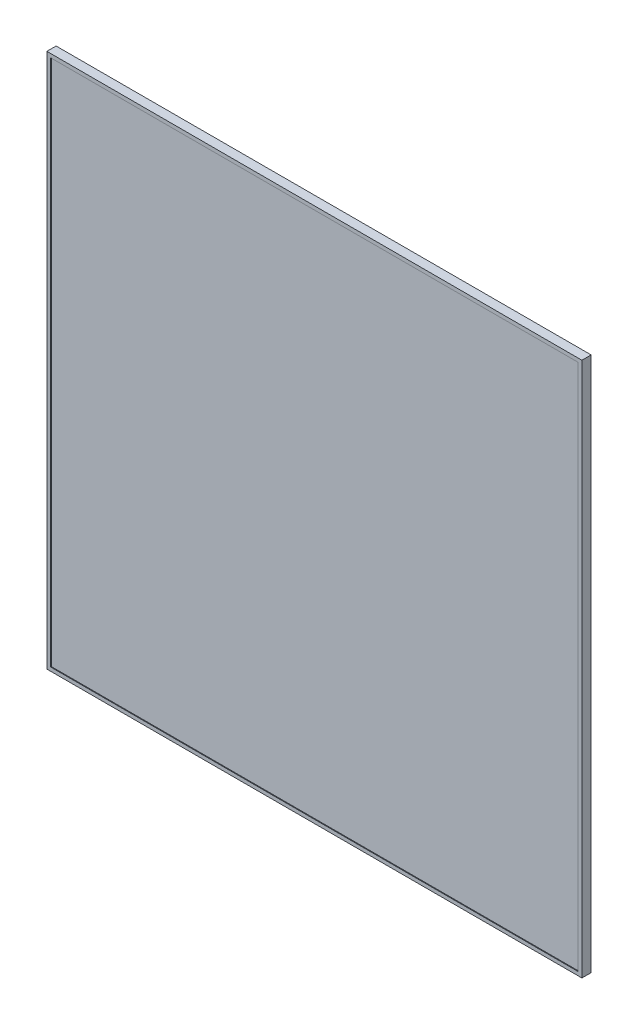
ISO-10303-21;
HEADER;
FILE_DESCRIPTION(('STEP AP214'),'2;1');
FILE_NAME('part.step','',(''),(''),'','','');
FILE_SCHEMA(('AUTOMOTIVE_DESIGN { 1 0 10303 214 1 1 1 1 }'));
ENDSEC;
DATA;
#1=APPLICATION_CONTEXT('core data for automotive mechanical design processes');
#2=APPLICATION_PROTOCOL_DEFINITION('international standard','automotive_design',2000,#1);
#3=PRODUCT_CONTEXT('',#1,'mechanical');
#4=PRODUCT('Part','Part','',(#3));
#5=PRODUCT_RELATED_PRODUCT_CATEGORY('part','',(#4));
#6=PRODUCT_DEFINITION_FORMATION('','',#4);
#7=PRODUCT_DEFINITION_CONTEXT('part definition',#1,'design');
#8=PRODUCT_DEFINITION('design','',#6,#7);
#9=PRODUCT_DEFINITION_SHAPE('','',#8);
#10=(LENGTH_UNIT() NAMED_UNIT(*) SI_UNIT(.MILLI.,.METRE.));
#11=(NAMED_UNIT(*) PLANE_ANGLE_UNIT() SI_UNIT($,.RADIAN.));
#12=(NAMED_UNIT(*) SI_UNIT($,.STERADIAN.) SOLID_ANGLE_UNIT());
#13=UNCERTAINTY_MEASURE_WITH_UNIT(LENGTH_MEASURE(1.E-05),#10,'distance_accuracy_value','');
#14=(GEOMETRIC_REPRESENTATION_CONTEXT(3) GLOBAL_UNCERTAINTY_ASSIGNED_CONTEXT((#13)) GLOBAL_UNIT_ASSIGNED_CONTEXT((#10,
#11,#12)) REPRESENTATION_CONTEXT('',''));
#15=CARTESIAN_POINT('',(0.,0.,0.));
#16=DIRECTION('',(0.,0.,1.));
#17=DIRECTION('',(1.,0.,0.));
#18=AXIS2_PLACEMENT_3D('',#15,#16,#17);
#19=CARTESIAN_POINT('',(72.5,72.5,1.25));
#20=DIRECTION('',(-1.,0.,0.));
#21=DIRECTION('',(0.,0.,1.));
#22=AXIS2_PLACEMENT_3D('',#19,#20,#21);
#23=PLANE('',#22);
#24=DIRECTION('',(0.,1.,0.));
#25=VECTOR('',#24,1.);
#26=CARTESIAN_POINT('',(72.5,72.5,-1.25));
#27=LINE('',#26,#25);
#28=CARTESIAN_POINT('',(72.5,-72.5,-1.25));
#29=VERTEX_POINT('',#28);
#30=CARTESIAN_POINT('',(72.5,72.5,-1.25));
#31=VERTEX_POINT('',#30);
#32=EDGE_CURVE('E158',#29,#31,#27,.T.);
#33=ORIENTED_EDGE('',*,*,#32,.T.);
#34=DIRECTION('',(0.,0.,-1.));
#35=VECTOR('',#34,1.);
#36=CARTESIAN_POINT('',(72.5,72.5,1.25));
#37=LINE('',#36,#35);
#38=CARTESIAN_POINT('',(72.5,72.5,1.25));
#39=VERTEX_POINT('',#38);
#40=EDGE_CURVE('E11',#39,#31,#37,.T.);
#41=ORIENTED_EDGE('',*,*,#40,.F.);
#42=DIRECTION('',(0.,1.,0.));
#43=VECTOR('',#42,1.);
#44=CARTESIAN_POINT('',(72.5,72.5,1.25));
#45=LINE('',#44,#43);
#46=CARTESIAN_POINT('',(72.5,-72.5,1.25));
#47=VERTEX_POINT('',#46);
#48=EDGE_CURVE('E164',#47,#39,#45,.T.);
#49=ORIENTED_EDGE('',*,*,#48,.F.);
#50=DIRECTION('',(0.,0.,-1.));
#51=VECTOR('',#50,1.);
#52=CARTESIAN_POINT('',(72.5,-72.5,1.25));
#53=LINE('',#52,#51);
#54=EDGE_CURVE('E174',#47,#29,#53,.T.);
#55=ORIENTED_EDGE('',*,*,#54,.T.);
#56=EDGE_LOOP('',(#33,#41,#49,#55));
#57=FACE_BOUND('',#56,.T.);
#58=ADVANCED_FACE('F39',(#57),#23,.F.);
#59=CARTESIAN_POINT('',(-72.5,72.5,1.25));
#60=DIRECTION('',(0.,-1.,0.));
#61=DIRECTION('',(0.,0.,-1.));
#62=AXIS2_PLACEMENT_3D('',#59,#60,#61);
#63=PLANE('',#62);
#64=DIRECTION('',(-1.,0.,0.));
#65=VECTOR('',#64,1.);
#66=CARTESIAN_POINT('',(-72.5,72.5,-1.25));
#67=LINE('',#66,#65);
#68=CARTESIAN_POINT('',(-72.5,72.5,-1.25));
#69=VERTEX_POINT('',#68);
#70=EDGE_CURVE('E178',#31,#69,#67,.T.);
#71=ORIENTED_EDGE('',*,*,#70,.T.);
#72=DIRECTION('',(0.,0.,-1.));
#73=VECTOR('',#72,1.);
#74=CARTESIAN_POINT('',(-72.5,72.5,1.25));
#75=LINE('',#74,#73);
#76=CARTESIAN_POINT('',(-72.5,72.5,1.25));
#77=VERTEX_POINT('',#76);
#78=EDGE_CURVE('E47',#77,#69,#75,.T.);
#79=ORIENTED_EDGE('',*,*,#78,.F.);
#80=DIRECTION('',(-1.,0.,0.));
#81=VECTOR('',#80,1.);
#82=CARTESIAN_POINT('',(-72.5,72.5,1.25));
#83=LINE('',#82,#81);
#84=EDGE_CURVE('E91',#39,#77,#83,.T.);
#85=ORIENTED_EDGE('',*,*,#84,.F.);
#86=ORIENTED_EDGE('',*,*,#40,.T.);
#87=EDGE_LOOP('',(#71,#79,#85,#86));
#88=FACE_BOUND('',#87,.T.);
#89=ADVANCED_FACE('F213',(#88),#63,.F.);
#90=CARTESIAN_POINT('',(-72.5,72.5,1.25));
#91=DIRECTION('',(1.,0.,0.));
#92=DIRECTION('',(0.,1.,0.));
#93=AXIS2_PLACEMENT_3D('',#90,#91,#92);
#94=PLANE('',#93);
#95=DIRECTION('',(0.,-1.,0.));
#96=VECTOR('',#95,1.);
#97=CARTESIAN_POINT('',(-72.5,72.5,-1.25));
#98=LINE('',#97,#96);
#99=CARTESIAN_POINT('',(-72.5,-72.5,-1.25));
#100=VERTEX_POINT('',#99);
#101=EDGE_CURVE('E181',#69,#100,#98,.T.);
#102=ORIENTED_EDGE('',*,*,#101,.T.);
#103=DIRECTION('',(0.,0.,-1.));
#104=VECTOR('',#103,1.);
#105=CARTESIAN_POINT('',(-72.5,-72.5,1.25));
#106=LINE('',#105,#104);
#107=CARTESIAN_POINT('',(-72.5,-72.5,1.25));
#108=VERTEX_POINT('',#107);
#109=EDGE_CURVE('E188',#108,#100,#106,.T.);
#110=ORIENTED_EDGE('',*,*,#109,.F.);
#111=DIRECTION('',(0.,-1.,0.));
#112=VECTOR('',#111,1.);
#113=CARTESIAN_POINT('',(-72.5,72.5,1.25));
#114=LINE('',#113,#112);
#115=EDGE_CURVE('E169',#77,#108,#114,.T.);
#116=ORIENTED_EDGE('',*,*,#115,.F.);
#117=ORIENTED_EDGE('',*,*,#78,.T.);
#118=EDGE_LOOP('',(#102,#110,#116,#117));
#119=FACE_BOUND('',#118,.T.);
#120=ADVANCED_FACE('F195',(#119),#94,.F.);
#121=CARTESIAN_POINT('',(-72.5,-72.5,1.25));
#122=DIRECTION('',(0.,1.,0.));
#123=DIRECTION('',(0.,0.,1.));
#124=AXIS2_PLACEMENT_3D('',#121,#122,#123);
#125=PLANE('',#124);
#126=DIRECTION('',(1.,0.,0.));
#127=VECTOR('',#126,1.);
#128=CARTESIAN_POINT('',(-72.5,-72.5,-1.25));
#129=LINE('',#128,#127);
#130=EDGE_CURVE('E84',#100,#29,#129,.T.);
#131=ORIENTED_EDGE('',*,*,#130,.T.);
#132=ORIENTED_EDGE('',*,*,#54,.F.);
#133=DIRECTION('',(1.,0.,0.));
#134=VECTOR('',#133,1.);
#135=CARTESIAN_POINT('',(-72.5,-72.5,1.25));
#136=LINE('',#135,#134);
#137=EDGE_CURVE('E63',#108,#47,#136,.T.);
#138=ORIENTED_EDGE('',*,*,#137,.F.);
#139=ORIENTED_EDGE('',*,*,#109,.T.);
#140=EDGE_LOOP('',(#131,#132,#138,#139));
#141=FACE_BOUND('',#140,.T.);
#142=ADVANCED_FACE('F203',(#141),#125,.F.);
#143=CARTESIAN_POINT('',(0.,0.,1.25));
#144=DIRECTION('',(0.,0.,1.));
#145=DIRECTION('',(1.,0.,0.));
#146=AXIS2_PLACEMENT_3D('',#143,#144,#145);
#147=PLANE('',#146);
#148=DIRECTION('',(0.,-1.,0.));
#149=VECTOR('',#148,1.);
#150=CARTESIAN_POINT('',(-71.5,-71.5,1.25));
#151=LINE('',#150,#149);
#152=CARTESIAN_POINT('',(-71.5,71.5,1.25));
#153=VERTEX_POINT('',#152);
#154=CARTESIAN_POINT('',(-71.5,-71.5,1.25));
#155=VERTEX_POINT('',#154);
#156=EDGE_CURVE('E54',#153,#155,#151,.T.);
#157=ORIENTED_EDGE('',*,*,#156,.F.);
#158=DIRECTION('',(-1.,0.,0.));
#159=VECTOR('',#158,1.);
#160=CARTESIAN_POINT('',(71.5,71.5,1.25));
#161=LINE('',#160,#159);
#162=CARTESIAN_POINT('',(71.5,71.5,1.25));
#163=VERTEX_POINT('',#162);
#164=EDGE_CURVE('E136',#163,#153,#161,.T.);
#165=ORIENTED_EDGE('',*,*,#164,.F.);
#166=DIRECTION('',(0.,1.,0.));
#167=VECTOR('',#166,1.);
#168=CARTESIAN_POINT('',(71.5,-71.5,1.25));
#169=LINE('',#168,#167);
#170=CARTESIAN_POINT('',(71.5,-71.5,1.25));
#171=VERTEX_POINT('',#170);
#172=EDGE_CURVE('E140',#171,#163,#169,.T.);
#173=ORIENTED_EDGE('',*,*,#172,.F.);
#174=DIRECTION('',(1.,0.,0.));
#175=VECTOR('',#174,1.);
#176=CARTESIAN_POINT('',(71.5,-71.5,1.25));
#177=LINE('',#176,#175);
#178=EDGE_CURVE('E149',#155,#171,#177,.T.);
#179=ORIENTED_EDGE('',*,*,#178,.F.);
#180=EDGE_LOOP('',(#157,#165,#173,#179));
#181=FACE_BOUND('',#180,.T.);
#182=ORIENTED_EDGE('',*,*,#48,.T.);
#183=ORIENTED_EDGE('',*,*,#84,.T.);
#184=ORIENTED_EDGE('',*,*,#115,.T.);
#185=ORIENTED_EDGE('',*,*,#137,.T.);
#186=EDGE_LOOP('',(#182,#183,#184,#185));
#187=FACE_BOUND('',#186,.T.);
#188=ADVANCED_FACE('F205',(#181,#187),#147,.T.);
#189=CARTESIAN_POINT('',(0.,0.,-1.25));
#190=DIRECTION('',(0.,0.,1.));
#191=DIRECTION('',(1.,0.,0.));
#192=AXIS2_PLACEMENT_3D('',#189,#190,#191);
#193=PLANE('',#192);
#194=ORIENTED_EDGE('',*,*,#32,.F.);
#195=ORIENTED_EDGE('',*,*,#130,.F.);
#196=ORIENTED_EDGE('',*,*,#101,.F.);
#197=ORIENTED_EDGE('',*,*,#70,.F.);
#198=EDGE_LOOP('',(#194,#195,#196,#197));
#199=FACE_BOUND('',#198,.T.);
#200=ADVANCED_FACE('F199',(#199),#193,.F.);
#201=CARTESIAN_POINT('',(-71.5,-71.5,1.05));
#202=DIRECTION('',(-1.,0.,0.));
#203=DIRECTION('',(0.,0.,1.));
#204=AXIS2_PLACEMENT_3D('',#201,#202,#203);
#205=PLANE('',#204);
#206=ORIENTED_EDGE('',*,*,#156,.T.);
#207=DIRECTION('',(0.,0.,1.));
#208=VECTOR('',#207,1.);
#209=CARTESIAN_POINT('',(-71.5,-71.5,1.05));
#210=LINE('',#209,#208);
#211=CARTESIAN_POINT('',(-71.5,-71.5,1.05));
#212=VERTEX_POINT('',#211);
#213=EDGE_CURVE('E111',#212,#155,#210,.T.);
#214=ORIENTED_EDGE('',*,*,#213,.F.);
#215=DIRECTION('',(0.,-1.,0.));
#216=VECTOR('',#215,1.);
#217=CARTESIAN_POINT('',(-71.5,-71.5,1.05));
#218=LINE('',#217,#216);
#219=CARTESIAN_POINT('',(-71.5,71.5,1.05));
#220=VERTEX_POINT('',#219);
#221=EDGE_CURVE('E115',#220,#212,#218,.T.);
#222=ORIENTED_EDGE('',*,*,#221,.F.);
#223=DIRECTION('',(0.,0.,1.));
#224=VECTOR('',#223,1.);
#225=CARTESIAN_POINT('',(-71.5,71.5,1.05));
#226=LINE('',#225,#224);
#227=EDGE_CURVE('E155',#220,#153,#226,.T.);
#228=ORIENTED_EDGE('',*,*,#227,.T.);
#229=EDGE_LOOP('',(#206,#214,#222,#228));
#230=FACE_BOUND('',#229,.T.);
#231=ADVANCED_FACE('F113',(#230),#205,.F.);
#232=CARTESIAN_POINT('',(71.5,71.5,1.05));
#233=DIRECTION('',(0.,1.,0.));
#234=DIRECTION('',(0.,0.,1.));
#235=AXIS2_PLACEMENT_3D('',#232,#233,#234);
#236=PLANE('',#235);
#237=ORIENTED_EDGE('',*,*,#164,.T.);
#238=ORIENTED_EDGE('',*,*,#227,.F.);
#239=DIRECTION('',(-1.,0.,0.));
#240=VECTOR('',#239,1.);
#241=CARTESIAN_POINT('',(71.5,71.5,1.05));
#242=LINE('',#241,#240);
#243=CARTESIAN_POINT('',(71.5,71.5,1.05));
#244=VERTEX_POINT('',#243);
#245=EDGE_CURVE('E122',#244,#220,#242,.T.);
#246=ORIENTED_EDGE('',*,*,#245,.F.);
#247=DIRECTION('',(0.,0.,1.));
#248=VECTOR('',#247,1.);
#249=CARTESIAN_POINT('',(71.5,71.5,1.05));
#250=LINE('',#249,#248);
#251=EDGE_CURVE('E159',#244,#163,#250,.T.);
#252=ORIENTED_EDGE('',*,*,#251,.T.);
#253=EDGE_LOOP('',(#237,#238,#246,#252));
#254=FACE_BOUND('',#253,.T.);
#255=ADVANCED_FACE('F252',(#254),#236,.F.);
#256=CARTESIAN_POINT('',(71.5,-71.5,1.05));
#257=DIRECTION('',(1.,0.,0.));
#258=DIRECTION('',(0.,0.,-1.));
#259=AXIS2_PLACEMENT_3D('',#256,#257,#258);
#260=PLANE('',#259);
#261=ORIENTED_EDGE('',*,*,#172,.T.);
#262=ORIENTED_EDGE('',*,*,#251,.F.);
#263=DIRECTION('',(0.,1.,0.));
#264=VECTOR('',#263,1.);
#265=CARTESIAN_POINT('',(71.5,-71.5,1.05));
#266=LINE('',#265,#264);
#267=CARTESIAN_POINT('',(71.5,-71.5,1.05));
#268=VERTEX_POINT('',#267);
#269=EDGE_CURVE('E131',#268,#244,#266,.T.);
#270=ORIENTED_EDGE('',*,*,#269,.F.);
#271=DIRECTION('',(0.,0.,1.));
#272=VECTOR('',#271,1.);
#273=CARTESIAN_POINT('',(71.5,-71.5,1.05));
#274=LINE('',#273,#272);
#275=EDGE_CURVE('E121',#268,#171,#274,.T.);
#276=ORIENTED_EDGE('',*,*,#275,.T.);
#277=EDGE_LOOP('',(#261,#262,#270,#276));
#278=FACE_BOUND('',#277,.T.);
#279=ADVANCED_FACE('F261',(#278),#260,.F.);
#280=CARTESIAN_POINT('',(71.5,-71.5,1.05));
#281=DIRECTION('',(0.,-1.,0.));
#282=DIRECTION('',(0.,0.,-1.));
#283=AXIS2_PLACEMENT_3D('',#280,#281,#282);
#284=PLANE('',#283);
#285=ORIENTED_EDGE('',*,*,#178,.T.);
#286=ORIENTED_EDGE('',*,*,#275,.F.);
#287=DIRECTION('',(1.,0.,0.));
#288=VECTOR('',#287,1.);
#289=CARTESIAN_POINT('',(71.5,-71.5,1.05));
#290=LINE('',#289,#288);
#291=EDGE_CURVE('E125',#212,#268,#290,.T.);
#292=ORIENTED_EDGE('',*,*,#291,.F.);
#293=ORIENTED_EDGE('',*,*,#213,.T.);
#294=EDGE_LOOP('',(#285,#286,#292,#293));
#295=FACE_BOUND('',#294,.T.);
#296=ADVANCED_FACE('F126',(#295),#284,.F.);
#297=CARTESIAN_POINT('',(0.,0.,1.05));
#298=DIRECTION('',(0.,0.,1.));
#299=DIRECTION('',(1.,0.,0.));
#300=AXIS2_PLACEMENT_3D('',#297,#298,#299);
#301=PLANE('',#300);
#302=ORIENTED_EDGE('',*,*,#221,.T.);
#303=ORIENTED_EDGE('',*,*,#291,.T.);
#304=ORIENTED_EDGE('',*,*,#269,.T.);
#305=ORIENTED_EDGE('',*,*,#245,.T.);
#306=EDGE_LOOP('',(#302,#303,#304,#305));
#307=FACE_BOUND('',#306,.T.);
#308=ADVANCED_FACE('F133',(#307),#301,.T.);
#309=CLOSED_SHELL('',(#58,#89,#120,#142,#188,#200,#231,#255,#279,#296,#308));
#310=MANIFOLD_SOLID_BREP('B2',#309);
#311=ADVANCED_BREP_SHAPE_REPRESENTATION('',(#18,#310),#14);
#312=SHAPE_DEFINITION_REPRESENTATION(#9,#311);
ENDSEC;
END-ISO-10303-21;
